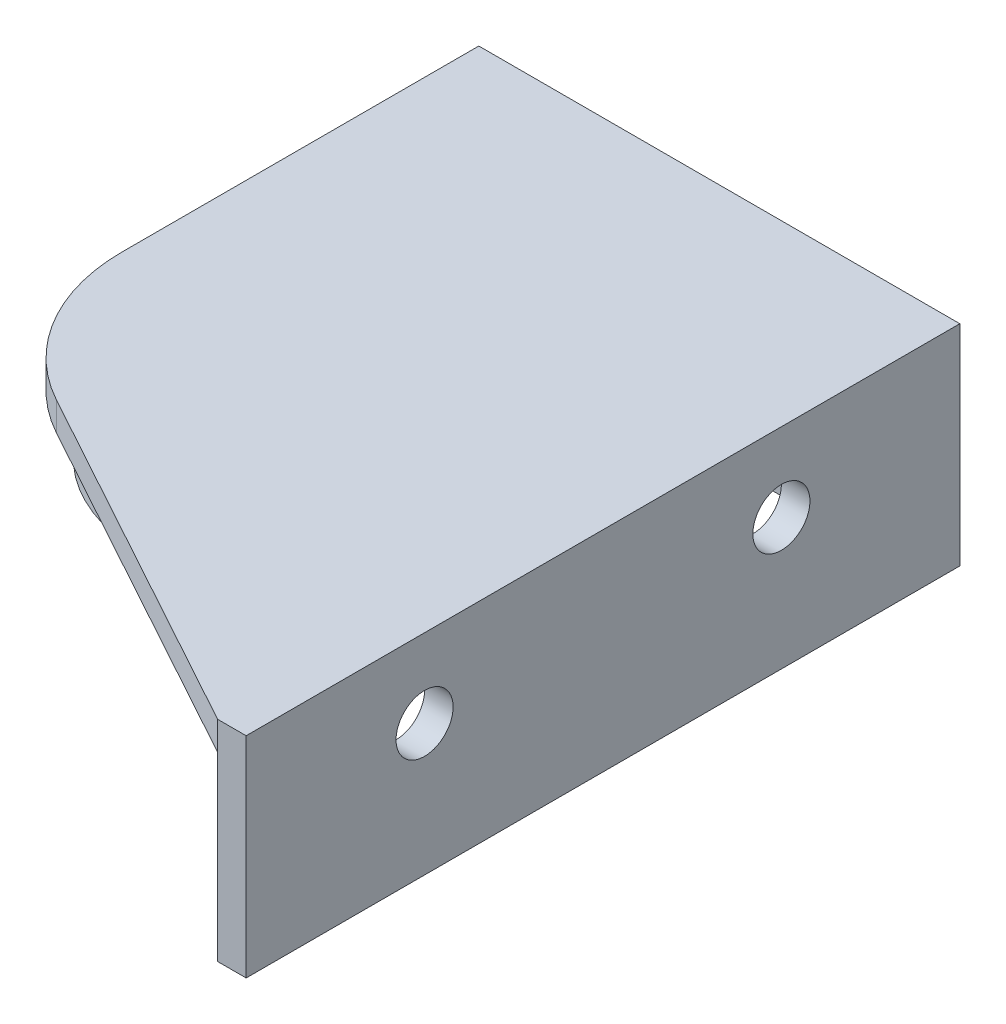
ISO-10303-21;
HEADER;
FILE_DESCRIPTION(('STEP AP214'),'2;1');
FILE_NAME('part.step','',(''),(''),'','','');
FILE_SCHEMA(('AUTOMOTIVE_DESIGN { 1 0 10303 214 1 1 1 1 }'));
ENDSEC;
DATA;
#1=APPLICATION_CONTEXT('core data for automotive mechanical design processes');
#2=APPLICATION_PROTOCOL_DEFINITION('international standard','automotive_design',2000,#1);
#3=PRODUCT_CONTEXT('',#1,'mechanical');
#4=PRODUCT('Part','Part','',(#3));
#5=PRODUCT_RELATED_PRODUCT_CATEGORY('part','',(#4));
#6=PRODUCT_DEFINITION_FORMATION('','',#4);
#7=PRODUCT_DEFINITION_CONTEXT('part definition',#1,'design');
#8=PRODUCT_DEFINITION('design','',#6,#7);
#9=PRODUCT_DEFINITION_SHAPE('','',#8);
#10=(LENGTH_UNIT() NAMED_UNIT(*) SI_UNIT(.MILLI.,.METRE.));
#11=(NAMED_UNIT(*) PLANE_ANGLE_UNIT() SI_UNIT($,.RADIAN.));
#12=(NAMED_UNIT(*) SI_UNIT($,.STERADIAN.) SOLID_ANGLE_UNIT());
#13=UNCERTAINTY_MEASURE_WITH_UNIT(LENGTH_MEASURE(1.E-05),#10,'distance_accuracy_value','');
#14=(GEOMETRIC_REPRESENTATION_CONTEXT(3) GLOBAL_UNCERTAINTY_ASSIGNED_CONTEXT((#13)) GLOBAL_UNIT_ASSIGNED_CONTEXT((#10,
#11,#12)) REPRESENTATION_CONTEXT('',''));
#15=CARTESIAN_POINT('',(0.,0.,0.));
#16=DIRECTION('',(0.,0.,1.));
#17=DIRECTION('',(1.,0.,0.));
#18=AXIS2_PLACEMENT_3D('',#15,#16,#17);
#19=CARTESIAN_POINT('',(0.,0.,0.));
#20=DIRECTION('',(0.,1.,0.));
#21=DIRECTION('',(0.,0.,1.));
#22=AXIS2_PLACEMENT_3D('',#19,#20,#21);
#23=PLANE('',#22);
#24=CARTESIAN_POINT('',(-4.,0.,0.));
#25=DIRECTION('',(0.,1.,0.));
#26=DIRECTION('',(0.,0.,1.));
#27=AXIS2_PLACEMENT_3D('',#24,#25,#26);
#28=CIRCLE('',#27,11.5);
#29=CARTESIAN_POINT('',(-4.,0.,11.5));
#30=VERTEX_POINT('',#29);
#31=EDGE_CURVE('E45',#30,#30,#28,.F.);
#32=ORIENTED_EDGE('',*,*,#31,.F.);
#33=EDGE_LOOP('',(#32));
#34=FACE_BOUND('',#33,.T.);
#35=DIRECTION('',(0.,0.,-1.));
#36=VECTOR('',#35,1.);
#37=CARTESIAN_POINT('',(14.85,0.,25.));
#38=LINE('',#37,#36);
#39=CARTESIAN_POINT('',(14.85,0.,25.));
#40=VERTEX_POINT('',#39);
#41=CARTESIAN_POINT('',(14.85,0.,-23.));
#42=VERTEX_POINT('',#41);
#43=EDGE_CURVE('E155',#40,#42,#38,.T.);
#44=ORIENTED_EDGE('',*,*,#43,.F.);
#45=DIRECTION('',(-0.876700969313921,0.,-0.481035768320851));
#46=VECTOR('',#45,1.);
#47=CARTESIAN_POINT('',(-7.10689126453905,0.,12.9525055531301));
#48=LINE('',#47,#46);
#49=CARTESIAN_POINT('',(-10.1813096229229,0.,11.2656074556839));
#50=VERTEX_POINT('',#49);
#51=EDGE_CURVE('E156',#40,#50,#48,.T.);
#52=ORIENTED_EDGE('',*,*,#51,.T.);
#53=CARTESIAN_POINT('',(-4.,0.,0.));
#54=DIRECTION('',(0.,1.,0.));
#55=DIRECTION('',(0.,0.,1.));
#56=AXIS2_PLACEMENT_3D('',#53,#54,#55);
#57=CIRCLE('',#56,12.85);
#58=CARTESIAN_POINT('',(-16.85,0.,0.));
#59=VERTEX_POINT('',#58);
#60=EDGE_CURVE('E192',#59,#50,#57,.T.);
#61=ORIENTED_EDGE('',*,*,#60,.F.);
#62=DIRECTION('',(0.,0.,1.));
#63=VECTOR('',#62,1.);
#64=CARTESIAN_POINT('',(-16.85,0.,25.));
#65=LINE('',#64,#63);
#66=CARTESIAN_POINT('',(-16.85,0.,-23.));
#67=VERTEX_POINT('',#66);
#68=EDGE_CURVE('E61',#67,#59,#65,.T.);
#69=ORIENTED_EDGE('',*,*,#68,.F.);
#70=DIRECTION('',(-1.,0.,0.));
#71=VECTOR('',#70,1.);
#72=CARTESIAN_POINT('',(14.85,0.,-23.));
#73=LINE('',#72,#71);
#74=EDGE_CURVE('E157',#42,#67,#73,.T.);
#75=ORIENTED_EDGE('',*,*,#74,.F.);
#76=EDGE_LOOP('',(#44,#52,#61,#69,#75));
#77=FACE_BOUND('',#76,.T.);
#78=ADVANCED_FACE('F37',(#34,#77),#23,.F.);
#79=CARTESIAN_POINT('',(-16.85,2.,25.));
#80=DIRECTION('',(1.,0.,0.));
#81=DIRECTION('',(0.,0.,-1.));
#82=AXIS2_PLACEMENT_3D('',#79,#80,#81);
#83=PLANE('',#82);
#84=ORIENTED_EDGE('',*,*,#68,.T.);
#85=DIRECTION('',(0.,1.,0.));
#86=VECTOR('',#85,1.);
#87=CARTESIAN_POINT('',(-16.85,-6.2,0.));
#88=LINE('',#87,#86);
#89=CARTESIAN_POINT('',(-16.85,2.,0.));
#90=VERTEX_POINT('',#89);
#91=EDGE_CURVE('E180',#59,#90,#88,.T.);
#92=ORIENTED_EDGE('',*,*,#91,.T.);
#93=DIRECTION('',(0.,0.,1.));
#94=VECTOR('',#93,1.);
#95=CARTESIAN_POINT('',(-16.85,2.,25.));
#96=LINE('',#95,#94);
#97=CARTESIAN_POINT('',(-16.85,2.,-25.));
#98=VERTEX_POINT('',#97);
#99=EDGE_CURVE('E140',#98,#90,#96,.T.);
#100=ORIENTED_EDGE('',*,*,#99,.F.);
#101=DIRECTION('',(0.,-1.,0.));
#102=VECTOR('',#101,1.);
#103=CARTESIAN_POINT('',(-16.85,2.,-25.));
#104=LINE('',#103,#102);
#105=CARTESIAN_POINT('',(-16.85,-12.7,-25.));
#106=VERTEX_POINT('',#105);
#107=EDGE_CURVE('E132',#98,#106,#104,.T.);
#108=ORIENTED_EDGE('',*,*,#107,.T.);
#109=DIRECTION('',(0.,0.,-1.));
#110=VECTOR('',#109,1.);
#111=CARTESIAN_POINT('',(-16.85,-12.7,-23.));
#112=LINE('',#111,#110);
#113=CARTESIAN_POINT('',(-16.85,-12.7,-23.));
#114=VERTEX_POINT('',#113);
#115=EDGE_CURVE('E217',#114,#106,#112,.T.);
#116=ORIENTED_EDGE('',*,*,#115,.F.);
#117=DIRECTION('',(0.,1.,0.));
#118=VECTOR('',#117,1.);
#119=CARTESIAN_POINT('',(-16.85,-12.7,-23.));
#120=LINE('',#119,#118);
#121=EDGE_CURVE('E171',#114,#67,#120,.T.);
#122=ORIENTED_EDGE('',*,*,#121,.T.);
#123=EDGE_LOOP('',(#84,#92,#100,#108,#116,#122));
#124=FACE_BOUND('',#123,.T.);
#125=ADVANCED_FACE('F39',(#124),#83,.F.);
#126=CARTESIAN_POINT('',(16.85,2.,25.));
#127=DIRECTION('',(0.,0.,-1.));
#128=DIRECTION('',(-1.,0.,0.));
#129=AXIS2_PLACEMENT_3D('',#126,#127,#128);
#130=PLANE('',#129);
#131=DIRECTION('',(1.,0.,0.));
#132=VECTOR('',#131,1.);
#133=CARTESIAN_POINT('',(16.85,2.,25.));
#134=LINE('',#133,#132);
#135=CARTESIAN_POINT('',(14.85,2.,25.));
#136=VERTEX_POINT('',#135);
#137=CARTESIAN_POINT('',(16.85,2.,25.));
#138=VERTEX_POINT('',#137);
#139=EDGE_CURVE('E119',#136,#138,#134,.T.);
#140=ORIENTED_EDGE('',*,*,#139,.F.);
#141=DIRECTION('',(0.,-1.,0.));
#142=VECTOR('',#141,1.);
#143=CARTESIAN_POINT('',(14.85,2.000012,25.));
#144=LINE('',#143,#142);
#145=EDGE_CURVE('E77',#136,#40,#144,.T.);
#146=ORIENTED_EDGE('',*,*,#145,.T.);
#147=DIRECTION('',(0.,1.,0.));
#148=VECTOR('',#147,1.);
#149=CARTESIAN_POINT('',(14.85,-12.7,25.));
#150=LINE('',#149,#148);
#151=CARTESIAN_POINT('',(14.85,-12.7,25.));
#152=VERTEX_POINT('',#151);
#153=EDGE_CURVE('E141',#152,#40,#150,.T.);
#154=ORIENTED_EDGE('',*,*,#153,.F.);
#155=DIRECTION('',(-1.,0.,0.));
#156=VECTOR('',#155,1.);
#157=CARTESIAN_POINT('',(16.85,-12.7,25.));
#158=LINE('',#157,#156);
#159=CARTESIAN_POINT('',(16.85,-12.7,25.));
#160=VERTEX_POINT('',#159);
#161=EDGE_CURVE('E163',#160,#152,#158,.T.);
#162=ORIENTED_EDGE('',*,*,#161,.F.);
#163=DIRECTION('',(0.,-1.,0.));
#164=VECTOR('',#163,1.);
#165=CARTESIAN_POINT('',(16.85,2.,25.));
#166=LINE('',#165,#164);
#167=EDGE_CURVE('E131',#138,#160,#166,.T.);
#168=ORIENTED_EDGE('',*,*,#167,.F.);
#169=EDGE_LOOP('',(#140,#146,#154,#162,#168));
#170=FACE_BOUND('',#169,.T.);
#171=ADVANCED_FACE('F224',(#170),#130,.F.);
#172=CARTESIAN_POINT('',(16.85,2.,25.));
#173=DIRECTION('',(-1.,0.,0.));
#174=DIRECTION('',(0.,0.,1.));
#175=AXIS2_PLACEMENT_3D('',#172,#173,#174);
#176=PLANE('',#175);
#177=CARTESIAN_POINT('',(16.85,-3.5,-12.5));
#178=DIRECTION('',(1.,0.,0.));
#179=DIRECTION('',(0.,0.,-1.));
#180=AXIS2_PLACEMENT_3D('',#177,#178,#179);
#181=CIRCLE('',#180,2.);
#182=CARTESIAN_POINT('',(16.85,-3.5,-14.5));
#183=VERTEX_POINT('',#182);
#184=EDGE_CURVE('E166',#183,#183,#181,.T.);
#185=ORIENTED_EDGE('',*,*,#184,.F.);
#186=EDGE_LOOP('',(#185));
#187=FACE_BOUND('',#186,.T.);
#188=CARTESIAN_POINT('',(16.85,-3.5,12.5));
#189=DIRECTION('',(1.,0.,0.));
#190=DIRECTION('',(0.,0.,-1.));
#191=AXIS2_PLACEMENT_3D('',#188,#189,#190);
#192=CIRCLE('',#191,2.);
#193=CARTESIAN_POINT('',(16.85,-3.5,10.5));
#194=VERTEX_POINT('',#193);
#195=EDGE_CURVE('E198',#194,#194,#192,.T.);
#196=ORIENTED_EDGE('',*,*,#195,.F.);
#197=EDGE_LOOP('',(#196));
#198=FACE_BOUND('',#197,.T.);
#199=ORIENTED_EDGE('',*,*,#167,.T.);
#200=DIRECTION('',(0.,0.,1.));
#201=VECTOR('',#200,1.);
#202=CARTESIAN_POINT('',(16.85,-12.7,-25.));
#203=LINE('',#202,#201);
#204=CARTESIAN_POINT('',(16.85,-12.7,-25.));
#205=VERTEX_POINT('',#204);
#206=EDGE_CURVE('E127',#205,#160,#203,.T.);
#207=ORIENTED_EDGE('',*,*,#206,.F.);
#208=DIRECTION('',(0.,-1.,0.));
#209=VECTOR('',#208,1.);
#210=CARTESIAN_POINT('',(16.85,2.,-25.));
#211=LINE('',#210,#209);
#212=CARTESIAN_POINT('',(16.85,2.,-25.));
#213=VERTEX_POINT('',#212);
#214=EDGE_CURVE('E124',#213,#205,#211,.T.);
#215=ORIENTED_EDGE('',*,*,#214,.F.);
#216=DIRECTION('',(0.,0.,-1.));
#217=VECTOR('',#216,1.);
#218=CARTESIAN_POINT('',(16.85,2.,25.));
#219=LINE('',#218,#217);
#220=EDGE_CURVE('E111',#138,#213,#219,.T.);
#221=ORIENTED_EDGE('',*,*,#220,.F.);
#222=EDGE_LOOP('',(#199,#207,#215,#221));
#223=FACE_BOUND('',#222,.T.);
#224=ADVANCED_FACE('F125',(#187,#198,#223),#176,.F.);
#225=CARTESIAN_POINT('',(16.85,2.,-25.));
#226=DIRECTION('',(0.,0.,1.));
#227=DIRECTION('',(1.,0.,0.));
#228=AXIS2_PLACEMENT_3D('',#225,#226,#227);
#229=PLANE('',#228);
#230=CARTESIAN_POINT('',(-9.85000000000001,-6.35,-25.));
#231=DIRECTION('',(0.,0.,1.));
#232=DIRECTION('',(1.,0.,0.));
#233=AXIS2_PLACEMENT_3D('',#230,#231,#232);
#234=CIRCLE('',#233,2.);
#235=CARTESIAN_POINT('',(-7.85000000000001,-6.35,-25.));
#236=VERTEX_POINT('',#235);
#237=EDGE_CURVE('E184',#236,#236,#234,.F.);
#238=ORIENTED_EDGE('',*,*,#237,.F.);
#239=EDGE_LOOP('',(#238));
#240=FACE_BOUND('',#239,.T.);
#241=CARTESIAN_POINT('',(7.84999999999999,-6.35,-25.));
#242=DIRECTION('',(0.,0.,1.));
#243=DIRECTION('',(1.,0.,0.));
#244=AXIS2_PLACEMENT_3D('',#241,#242,#243);
#245=CIRCLE('',#244,2.);
#246=CARTESIAN_POINT('',(9.84999999999999,-6.35,-25.));
#247=VERTEX_POINT('',#246);
#248=EDGE_CURVE('E187',#247,#247,#245,.F.);
#249=ORIENTED_EDGE('',*,*,#248,.F.);
#250=EDGE_LOOP('',(#249));
#251=FACE_BOUND('',#250,.T.);
#252=ORIENTED_EDGE('',*,*,#214,.T.);
#253=DIRECTION('',(1.,0.,0.));
#254=VECTOR('',#253,1.);
#255=CARTESIAN_POINT('',(-16.85,-12.7,-25.));
#256=LINE('',#255,#254);
#257=EDGE_CURVE('E218',#106,#205,#256,.T.);
#258=ORIENTED_EDGE('',*,*,#257,.F.);
#259=ORIENTED_EDGE('',*,*,#107,.F.);
#260=DIRECTION('',(-1.,0.,0.));
#261=VECTOR('',#260,1.);
#262=CARTESIAN_POINT('',(16.85,2.,-25.));
#263=LINE('',#262,#261);
#264=EDGE_CURVE('E116',#213,#98,#263,.T.);
#265=ORIENTED_EDGE('',*,*,#264,.F.);
#266=EDGE_LOOP('',(#252,#258,#259,#265));
#267=FACE_BOUND('',#266,.T.);
#268=ADVANCED_FACE('F134',(#240,#251,#267),#229,.F.);
#269=CARTESIAN_POINT('',(0.,2.,0.));
#270=DIRECTION('',(0.,1.,0.));
#271=DIRECTION('',(0.,0.,1.));
#272=AXIS2_PLACEMENT_3D('',#269,#270,#271);
#273=PLANE('',#272);
#274=DIRECTION('',(-0.876700969313921,0.,-0.481035768320851));
#275=VECTOR('',#274,1.);
#276=CARTESIAN_POINT('',(-7.10689126453905,2.,12.9525055531301));
#277=LINE('',#276,#275);
#278=CARTESIAN_POINT('',(-10.1813096229229,2.,11.2656074556839));
#279=VERTEX_POINT('',#278);
#280=EDGE_CURVE('E182',#136,#279,#277,.T.);
#281=ORIENTED_EDGE('',*,*,#280,.F.);
#282=ORIENTED_EDGE('',*,*,#139,.T.);
#283=ORIENTED_EDGE('',*,*,#220,.T.);
#284=ORIENTED_EDGE('',*,*,#264,.T.);
#285=ORIENTED_EDGE('',*,*,#99,.T.);
#286=CARTESIAN_POINT('',(-4.,2.,0.));
#287=DIRECTION('',(0.,1.,0.));
#288=DIRECTION('',(0.,0.,1.));
#289=AXIS2_PLACEMENT_3D('',#286,#287,#288);
#290=CIRCLE('',#289,12.85);
#291=EDGE_CURVE('E12',#90,#279,#290,.T.);
#292=ORIENTED_EDGE('',*,*,#291,.T.);
#293=EDGE_LOOP('',(#281,#282,#283,#284,#285,#292));
#294=FACE_BOUND('',#293,.T.);
#295=ADVANCED_FACE('F113',(#294),#273,.T.);
#296=CARTESIAN_POINT('',(14.85,-12.7,25.));
#297=DIRECTION('',(1.,0.,0.));
#298=DIRECTION('',(0.,0.,-1.));
#299=AXIS2_PLACEMENT_3D('',#296,#297,#298);
#300=PLANE('',#299);
#301=CARTESIAN_POINT('',(14.85,-3.5,-12.5));
#302=DIRECTION('',(1.,0.,0.));
#303=DIRECTION('',(0.,0.,-1.));
#304=AXIS2_PLACEMENT_3D('',#301,#302,#303);
#305=CIRCLE('',#304,2.);
#306=CARTESIAN_POINT('',(14.85,-3.5,-14.5));
#307=VERTEX_POINT('',#306);
#308=EDGE_CURVE('E161',#307,#307,#305,.F.);
#309=ORIENTED_EDGE('',*,*,#308,.F.);
#310=EDGE_LOOP('',(#309));
#311=FACE_BOUND('',#310,.T.);
#312=CARTESIAN_POINT('',(14.85,-3.5,12.5));
#313=DIRECTION('',(1.,0.,0.));
#314=DIRECTION('',(0.,0.,-1.));
#315=AXIS2_PLACEMENT_3D('',#312,#313,#314);
#316=CIRCLE('',#315,2.);
#317=CARTESIAN_POINT('',(14.85,-3.5,10.5));
#318=VERTEX_POINT('',#317);
#319=EDGE_CURVE('E205',#318,#318,#316,.F.);
#320=ORIENTED_EDGE('',*,*,#319,.F.);
#321=EDGE_LOOP('',(#320));
#322=FACE_BOUND('',#321,.T.);
#323=ORIENTED_EDGE('',*,*,#43,.T.);
#324=DIRECTION('',(0.,1.,0.));
#325=VECTOR('',#324,1.);
#326=CARTESIAN_POINT('',(14.85,-12.7,-23.));
#327=LINE('',#326,#325);
#328=CARTESIAN_POINT('',(14.85,-12.7,-23.));
#329=VERTEX_POINT('',#328);
#330=EDGE_CURVE('E174',#329,#42,#327,.T.);
#331=ORIENTED_EDGE('',*,*,#330,.F.);
#332=DIRECTION('',(0.,0.,-1.));
#333=VECTOR('',#332,1.);
#334=CARTESIAN_POINT('',(14.85,-12.7,25.));
#335=LINE('',#334,#333);
#336=EDGE_CURVE('E213',#152,#329,#335,.T.);
#337=ORIENTED_EDGE('',*,*,#336,.F.);
#338=ORIENTED_EDGE('',*,*,#153,.T.);
#339=EDGE_LOOP('',(#323,#331,#337,#338));
#340=FACE_BOUND('',#339,.T.);
#341=ADVANCED_FACE('F225',(#311,#322,#340),#300,.F.);
#342=CARTESIAN_POINT('',(14.85,-12.7,-23.));
#343=DIRECTION('',(0.,0.,-1.));
#344=DIRECTION('',(-1.,0.,0.));
#345=AXIS2_PLACEMENT_3D('',#342,#343,#344);
#346=PLANE('',#345);
#347=CARTESIAN_POINT('',(-9.85000000000001,-6.35,-23.));
#348=DIRECTION('',(0.,0.,1.));
#349=DIRECTION('',(1.,0.,0.));
#350=AXIS2_PLACEMENT_3D('',#347,#348,#349);
#351=CIRCLE('',#350,2.);
#352=CARTESIAN_POINT('',(-7.85000000000001,-6.35,-23.));
#353=VERTEX_POINT('',#352);
#354=EDGE_CURVE('E389',#353,#353,#351,.T.);
#355=ORIENTED_EDGE('',*,*,#354,.F.);
#356=EDGE_LOOP('',(#355));
#357=FACE_BOUND('',#356,.T.);
#358=CARTESIAN_POINT('',(7.84999999999999,-6.35,-23.));
#359=DIRECTION('',(0.,0.,1.));
#360=DIRECTION('',(1.,0.,0.));
#361=AXIS2_PLACEMENT_3D('',#358,#359,#360);
#362=CIRCLE('',#361,2.);
#363=CARTESIAN_POINT('',(9.84999999999999,-6.35,-23.));
#364=VERTEX_POINT('',#363);
#365=EDGE_CURVE('E394',#364,#364,#362,.T.);
#366=ORIENTED_EDGE('',*,*,#365,.F.);
#367=EDGE_LOOP('',(#366));
#368=FACE_BOUND('',#367,.T.);
#369=ORIENTED_EDGE('',*,*,#74,.T.);
#370=ORIENTED_EDGE('',*,*,#121,.F.);
#371=DIRECTION('',(-1.,0.,0.));
#372=VECTOR('',#371,1.);
#373=CARTESIAN_POINT('',(14.85,-12.7,-23.));
#374=LINE('',#373,#372);
#375=EDGE_CURVE('E215',#329,#114,#374,.T.);
#376=ORIENTED_EDGE('',*,*,#375,.F.);
#377=ORIENTED_EDGE('',*,*,#330,.T.);
#378=EDGE_LOOP('',(#369,#370,#376,#377));
#379=FACE_BOUND('',#378,.T.);
#380=ADVANCED_FACE('F260',(#357,#368,#379),#346,.F.);
#381=CARTESIAN_POINT('',(0.,-12.7,0.));
#382=DIRECTION('',(0.,-1.,0.));
#383=DIRECTION('',(0.,0.,-1.));
#384=AXIS2_PLACEMENT_3D('',#381,#382,#383);
#385=PLANE('',#384);
#386=ORIENTED_EDGE('',*,*,#161,.T.);
#387=ORIENTED_EDGE('',*,*,#336,.T.);
#388=ORIENTED_EDGE('',*,*,#375,.T.);
#389=ORIENTED_EDGE('',*,*,#115,.T.);
#390=ORIENTED_EDGE('',*,*,#257,.T.);
#391=ORIENTED_EDGE('',*,*,#206,.T.);
#392=EDGE_LOOP('',(#386,#387,#388,#389,#390,#391));
#393=FACE_BOUND('',#392,.T.);
#394=ADVANCED_FACE('F221',(#393),#385,.T.);
#395=CARTESIAN_POINT('',(-16.851,-3.5,12.5));
#396=DIRECTION('',(1.,0.,0.));
#397=DIRECTION('',(0.,0.,-1.));
#398=AXIS2_PLACEMENT_3D('',#395,#396,#397);
#399=CYLINDRICAL_SURFACE('',#398,2.);
#400=ORIENTED_EDGE('',*,*,#195,.T.);
#401=EDGE_LOOP('',(#400));
#402=FACE_BOUND('',#401,.T.);
#403=ORIENTED_EDGE('',*,*,#319,.T.);
#404=EDGE_LOOP('',(#403));
#405=FACE_BOUND('',#404,.T.);
#406=ADVANCED_FACE('F253',(#402,#405),#399,.F.);
#407=CARTESIAN_POINT('',(-16.851,-3.5,-12.5));
#408=DIRECTION('',(1.,0.,0.));
#409=DIRECTION('',(0.,0.,-1.));
#410=AXIS2_PLACEMENT_3D('',#407,#408,#409);
#411=CYLINDRICAL_SURFACE('',#410,2.);
#412=ORIENTED_EDGE('',*,*,#184,.T.);
#413=EDGE_LOOP('',(#412));
#414=FACE_BOUND('',#413,.T.);
#415=ORIENTED_EDGE('',*,*,#308,.T.);
#416=EDGE_LOOP('',(#415));
#417=FACE_BOUND('',#416,.T.);
#418=ADVANCED_FACE('F250',(#414,#417),#411,.F.);
#419=CARTESIAN_POINT('',(-4.,-45.2269119345812,0.));
#420=DIRECTION('',(0.,1.,0.));
#421=DIRECTION('',(0.,0.,1.));
#422=AXIS2_PLACEMENT_3D('',#419,#420,#421);
#423=CYLINDRICAL_SURFACE('',#422,11.5);
#424=ORIENTED_EDGE('',*,*,#31,.T.);
#425=EDGE_LOOP('',(#424));
#426=FACE_BOUND('',#425,.T.);
#427=CARTESIAN_POINT('',(-4.,-4.1,0.));
#428=DIRECTION('',(0.,-1.,0.));
#429=DIRECTION('',(0.,0.,-1.));
#430=AXIS2_PLACEMENT_3D('',#427,#428,#429);
#431=CIRCLE('',#430,11.5);
#432=CARTESIAN_POINT('',(-4.,-4.1,-11.5));
#433=VERTEX_POINT('',#432);
#434=EDGE_CURVE('E195',#433,#433,#431,.T.);
#435=ORIENTED_EDGE('',*,*,#434,.F.);
#436=EDGE_LOOP('',(#435));
#437=FACE_BOUND('',#436,.T.);
#438=ADVANCED_FACE('F146',(#426,#437),#423,.T.);
#439=CARTESIAN_POINT('',(-4.,-45.2269119345812,0.));
#440=DIRECTION('',(0.,1.,0.));
#441=DIRECTION('',(0.,0.,1.));
#442=AXIS2_PLACEMENT_3D('',#439,#440,#441);
#443=CYLINDRICAL_SURFACE('',#442,5.5);
#444=CARTESIAN_POINT('',(-4.,0.,0.));
#445=DIRECTION('',(0.,-1.,0.));
#446=DIRECTION('',(0.,0.,-1.));
#447=AXIS2_PLACEMENT_3D('',#444,#445,#446);
#448=CIRCLE('',#447,5.5);
#449=CARTESIAN_POINT('',(-4.,0.,-5.5));
#450=VERTEX_POINT('',#449);
#451=EDGE_CURVE('E199',#450,#450,#448,.T.);
#452=ORIENTED_EDGE('',*,*,#451,.F.);
#453=EDGE_LOOP('',(#452));
#454=FACE_BOUND('',#453,.T.);
#455=CARTESIAN_POINT('',(-4.,-4.1,0.));
#456=DIRECTION('',(0.,-1.,0.));
#457=DIRECTION('',(0.,0.,-1.));
#458=AXIS2_PLACEMENT_3D('',#455,#456,#457);
#459=CIRCLE('',#458,5.5);
#460=CARTESIAN_POINT('',(-4.,-4.1,-5.5));
#461=VERTEX_POINT('',#460);
#462=EDGE_CURVE('E194',#461,#461,#459,.T.);
#463=ORIENTED_EDGE('',*,*,#462,.T.);
#464=EDGE_LOOP('',(#463));
#465=FACE_BOUND('',#464,.T.);
#466=ADVANCED_FACE('F243',(#454,#465),#443,.F.);
#467=CARTESIAN_POINT('',(0.,-4.1,0.));
#468=DIRECTION('',(0.,-1.,0.));
#469=DIRECTION('',(0.,0.,-1.));
#470=AXIS2_PLACEMENT_3D('',#467,#468,#469);
#471=PLANE('',#470);
#472=ORIENTED_EDGE('',*,*,#462,.F.);
#473=EDGE_LOOP('',(#472));
#474=FACE_BOUND('',#473,.T.);
#475=ORIENTED_EDGE('',*,*,#434,.T.);
#476=EDGE_LOOP('',(#475));
#477=FACE_BOUND('',#476,.T.);
#478=ADVANCED_FACE('F240',(#474,#477),#471,.T.);
#479=ORIENTED_EDGE('',*,*,#451,.T.);
#480=EDGE_LOOP('',(#479));
#481=FACE_BOUND('',#480,.T.);
#482=ADVANCED_FACE('F151',(#481),#23,.F.);
#483=CARTESIAN_POINT('',(-4.,-6.2,0.));
#484=DIRECTION('',(0.,1.,0.));
#485=DIRECTION('',(0.,0.,1.));
#486=AXIS2_PLACEMENT_3D('',#483,#484,#485);
#487=CYLINDRICAL_SURFACE('',#486,12.85);
#488=ORIENTED_EDGE('',*,*,#60,.T.);
#489=DIRECTION('',(0.,1.,0.));
#490=VECTOR('',#489,1.);
#491=CARTESIAN_POINT('',(-10.1813096229229,-6.2,11.2656074556839));
#492=LINE('',#491,#490);
#493=EDGE_CURVE('E52',#50,#279,#492,.T.);
#494=ORIENTED_EDGE('',*,*,#493,.T.);
#495=ORIENTED_EDGE('',*,*,#291,.F.);
#496=ORIENTED_EDGE('',*,*,#91,.F.);
#497=EDGE_LOOP('',(#488,#494,#495,#496));
#498=FACE_BOUND('',#497,.T.);
#499=ADVANCED_FACE('F229',(#498),#487,.T.);
#500=CARTESIAN_POINT('',(-10.1813096229229,2.000012,11.2656074556839));
#501=DIRECTION('',(0.481035768320851,0.,-0.876700969313921));
#502=DIRECTION('',(-0.876700969313921,0.,-0.481035768320851));
#503=AXIS2_PLACEMENT_3D('',#500,#501,#502);
#504=PLANE('',#503);
#505=ORIENTED_EDGE('',*,*,#145,.F.);
#506=ORIENTED_EDGE('',*,*,#280,.T.);
#507=ORIENTED_EDGE('',*,*,#493,.F.);
#508=ORIENTED_EDGE('',*,*,#51,.F.);
#509=EDGE_LOOP('',(#505,#506,#507,#508));
#510=FACE_BOUND('',#509,.T.);
#511=ADVANCED_FACE('F226',(#510),#504,.F.);
#512=CARTESIAN_POINT('',(7.84999999999999,-6.35,-25.001));
#513=DIRECTION('',(0.,0.,1.));
#514=DIRECTION('',(1.,0.,0.));
#515=AXIS2_PLACEMENT_3D('',#512,#513,#514);
#516=CYLINDRICAL_SURFACE('',#515,2.);
#517=ORIENTED_EDGE('',*,*,#365,.T.);
#518=EDGE_LOOP('',(#517));
#519=FACE_BOUND('',#518,.T.);
#520=ORIENTED_EDGE('',*,*,#248,.T.);
#521=EDGE_LOOP('',(#520));
#522=FACE_BOUND('',#521,.T.);
#523=ADVANCED_FACE('F228',(#519,#522),#516,.F.);
#524=CARTESIAN_POINT('',(-9.85000000000001,-6.35,-25.001));
#525=DIRECTION('',(0.,0.,1.));
#526=DIRECTION('',(1.,0.,0.));
#527=AXIS2_PLACEMENT_3D('',#524,#525,#526);
#528=CYLINDRICAL_SURFACE('',#527,2.);
#529=ORIENTED_EDGE('',*,*,#354,.T.);
#530=EDGE_LOOP('',(#529));
#531=FACE_BOUND('',#530,.T.);
#532=ORIENTED_EDGE('',*,*,#237,.T.);
#533=EDGE_LOOP('',(#532));
#534=FACE_BOUND('',#533,.T.);
#535=ADVANCED_FACE('F235',(#531,#534),#528,.F.);
#536=CLOSED_SHELL('',(#78,#125,#171,#224,#268,#295,#341,#380,#394,#406,#418,#438,#466,#478,#482,
#499,#511,#523,#535));
#537=MANIFOLD_SOLID_BREP('B2',#536);
#538=ADVANCED_BREP_SHAPE_REPRESENTATION('',(#18,#537),#14);
#539=SHAPE_DEFINITION_REPRESENTATION(#9,#538);
ENDSEC;
END-ISO-10303-21;
